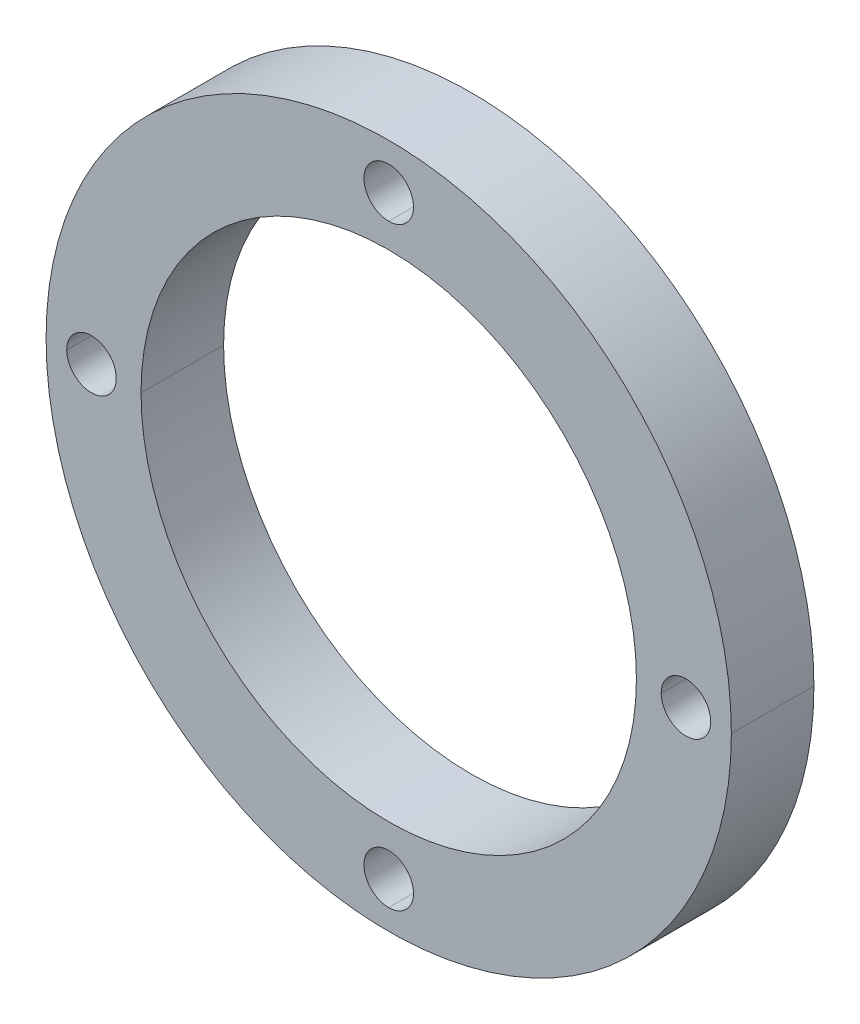
ISO-10303-21;
HEADER;
FILE_DESCRIPTION(('STEP AP214'),'2;1');
FILE_NAME('part.step','',(''),(''),'','','');
FILE_SCHEMA(('AUTOMOTIVE_DESIGN { 1 0 10303 214 1 1 1 1 }'));
ENDSEC;
DATA;
#1=APPLICATION_CONTEXT('core data for automotive mechanical design processes');
#2=APPLICATION_PROTOCOL_DEFINITION('international standard','automotive_design',2000,#1);
#3=PRODUCT_CONTEXT('',#1,'mechanical');
#4=PRODUCT('Part','Part','',(#3));
#5=PRODUCT_RELATED_PRODUCT_CATEGORY('part','',(#4));
#6=PRODUCT_DEFINITION_FORMATION('','',#4);
#7=PRODUCT_DEFINITION_CONTEXT('part definition',#1,'design');
#8=PRODUCT_DEFINITION('design','',#6,#7);
#9=PRODUCT_DEFINITION_SHAPE('','',#8);
#10=(LENGTH_UNIT() NAMED_UNIT(*) SI_UNIT(.MILLI.,.METRE.));
#11=(NAMED_UNIT(*) PLANE_ANGLE_UNIT() SI_UNIT($,.RADIAN.));
#12=(NAMED_UNIT(*) SI_UNIT($,.STERADIAN.) SOLID_ANGLE_UNIT());
#13=UNCERTAINTY_MEASURE_WITH_UNIT(LENGTH_MEASURE(1.E-05),#10,'distance_accuracy_value','');
#14=(GEOMETRIC_REPRESENTATION_CONTEXT(3) GLOBAL_UNCERTAINTY_ASSIGNED_CONTEXT((#13)) GLOBAL_UNIT_ASSIGNED_CONTEXT((#10,
#11,#12)) REPRESENTATION_CONTEXT('',''));
#15=CARTESIAN_POINT('',(0.,0.,0.));
#16=DIRECTION('',(0.,0.,1.));
#17=DIRECTION('',(1.,0.,0.));
#18=AXIS2_PLACEMENT_3D('',#15,#16,#17);
#19=CARTESIAN_POINT('',(199.4677415,-219.4589499,666.9));
#20=CARTESIAN_POINT('',(199.4677415,-219.4589499,671.9));
#21=(BOUNDED_CURVE() B_SPLINE_CURVE(1,(#19,#20),.UNSPECIFIED.,.F.,
.F.) B_SPLINE_CURVE_WITH_KNOTS((2,2),(0.,1.),
.UNSPECIFIED.) CURVE() GEOMETRIC_REPRESENTATION_ITEM() RATIONAL_B_SPLINE_CURVE((1.,1.)) REPRESENTATION_ITEM(''));
#22=CARTESIAN_POINT('',(197.9677415,-219.4589499,669.4));
#23=DIRECTION('',(0.,0.,1.));
#24=AXIS1_PLACEMENT('',#22,#23);
#25=SURFACE_OF_REVOLUTION('',#21,#24);
#26=CARTESIAN_POINT('',(197.9677415,-219.4589499,671.9));
#27=DIRECTION('',(0.,0.,1.));
#28=DIRECTION('',(1.,0.,0.));
#29=AXIS2_PLACEMENT_3D('',#26,#27,#28);
#30=CIRCLE('',#29,1.5);
#31=CARTESIAN_POINT('',(199.4677415,-219.4589499,671.9));
#32=VERTEX_POINT('',#31);
#33=CARTESIAN_POINT('',(196.4677415,-219.4589499,671.9));
#34=VERTEX_POINT('',#33);
#35=EDGE_CURVE('E102',#32,#34,#30,.T.);
#36=ORIENTED_EDGE('',*,*,#35,.T.);
#37=CARTESIAN_POINT('',(196.4677415,-219.4589499,671.9));
#38=CARTESIAN_POINT('',(196.4677415,-219.4589499,671.691666666667));
#39=CARTESIAN_POINT('',(196.4677415,-219.4589499,671.483333333333));
#40=CARTESIAN_POINT('',(196.4677415,-219.4589499,671.066666666667));
#41=CARTESIAN_POINT('',(196.4677415,-219.4589499,670.858333333333));
#42=CARTESIAN_POINT('',(196.4677415,-219.4589499,670.441666666667));
#43=CARTESIAN_POINT('',(196.4677415,-219.4589499,670.233333333333));
#44=CARTESIAN_POINT('',(196.4677415,-219.4589499,669.816666666667));
#45=CARTESIAN_POINT('',(196.4677415,-219.4589499,669.608333333333));
#46=CARTESIAN_POINT('',(196.4677415,-219.4589499,669.191666666667));
#47=CARTESIAN_POINT('',(196.4677415,-219.4589499,668.983333333333));
#48=CARTESIAN_POINT('',(196.4677415,-219.4589499,668.566666666667));
#49=CARTESIAN_POINT('',(196.4677415,-219.4589499,668.358333333333));
#50=CARTESIAN_POINT('',(196.4677415,-219.4589499,667.941666666667));
#51=CARTESIAN_POINT('',(196.4677415,-219.4589499,667.733333333333));
#52=CARTESIAN_POINT('',(196.4677415,-219.4589499,667.316666666667));
#53=CARTESIAN_POINT('',(196.4677415,-219.4589499,667.108333333333));
#54=CARTESIAN_POINT('',(196.4677415,-219.4589499,666.9));
#55=B_SPLINE_CURVE_WITH_KNOTS('',3,(#37,#38,#39,#40,#41,#42,#43,#44,#45,#46,#47,#48,#49,#50,#51,
#52,#53,#54),.UNSPECIFIED.,.F.,.F.,(4,2,2,2,2,2,2,2,4),(0.,0.624999999999987,1.24999999999997,
1.87499999999996,2.50000000000006,3.12499999999993,3.75000000000003,4.37500000000002,5.),.UNSPECIFIED.);
#56=CARTESIAN_POINT('',(196.4677415,-219.4589499,666.9));
#57=VERTEX_POINT('',#56);
#58=EDGE_CURVE('E125',#34,#57,#55,.T.);
#59=ORIENTED_EDGE('',*,*,#58,.T.);
#60=CARTESIAN_POINT('',(197.9677415,-219.4589499,666.9));
#61=DIRECTION('',(0.,0.,-1.));
#62=DIRECTION('',(-1.,0.,0.));
#63=AXIS2_PLACEMENT_3D('',#60,#61,#62);
#64=CIRCLE('',#63,1.5);
#65=CARTESIAN_POINT('',(199.4677415,-219.4589499,666.9));
#66=VERTEX_POINT('',#65);
#67=EDGE_CURVE('E118',#57,#66,#64,.T.);
#68=ORIENTED_EDGE('',*,*,#67,.T.);
#69=CARTESIAN_POINT('',(199.4677415,-219.4589499,666.9));
#70=CARTESIAN_POINT('',(199.4677415,-219.4589499,667.108333333333));
#71=CARTESIAN_POINT('',(199.4677415,-219.4589499,667.316666666667));
#72=CARTESIAN_POINT('',(199.4677415,-219.4589499,667.733333333333));
#73=CARTESIAN_POINT('',(199.4677415,-219.4589499,667.941666666667));
#74=CARTESIAN_POINT('',(199.4677415,-219.4589499,668.358333333333));
#75=CARTESIAN_POINT('',(199.4677415,-219.4589499,668.566666666667));
#76=CARTESIAN_POINT('',(199.4677415,-219.4589499,668.983333333333));
#77=CARTESIAN_POINT('',(199.4677415,-219.4589499,669.191666666667));
#78=CARTESIAN_POINT('',(199.4677415,-219.4589499,669.608333333333));
#79=CARTESIAN_POINT('',(199.4677415,-219.4589499,669.816666666667));
#80=CARTESIAN_POINT('',(199.4677415,-219.4589499,670.233333333333));
#81=CARTESIAN_POINT('',(199.4677415,-219.4589499,670.441666666667));
#82=CARTESIAN_POINT('',(199.4677415,-219.4589499,670.858333333333));
#83=CARTESIAN_POINT('',(199.4677415,-219.4589499,671.066666666667));
#84=CARTESIAN_POINT('',(199.4677415,-219.4589499,671.483333333333));
#85=CARTESIAN_POINT('',(199.4677415,-219.4589499,671.691666666667));
#86=CARTESIAN_POINT('',(199.4677415,-219.4589499,671.9));
#87=B_SPLINE_CURVE_WITH_KNOTS('',3,(#69,#70,#71,#72,#73,#74,#75,#76,#77,#78,#79,#80,#81,#82,#83,
#84,#85,#86),.UNSPECIFIED.,.F.,.F.,(4,2,2,2,2,2,2,2,4),(0.,0.624999999999987,1.24999999999997,
1.87500000000007,2.49999999999995,3.12500000000004,3.75000000000003,4.37500000000002,5.),.UNSPECIFIED.);
#88=EDGE_CURVE('E116',#66,#32,#87,.T.);
#89=ORIENTED_EDGE('',*,*,#88,.T.);
#90=EDGE_LOOP('',(#36,#59,#68,#89));
#91=FACE_BOUND('',#90,.T.);
#92=ADVANCED_FACE('F14',(#91),#25,.F.);
#93=CARTESIAN_POINT('',(196.4677415,-219.4589499,666.9));
#94=CARTESIAN_POINT('',(196.4677415,-219.4589499,671.9));
#95=(BOUNDED_CURVE() B_SPLINE_CURVE(1,(#93,#94),.UNSPECIFIED.,.F.,
.F.) B_SPLINE_CURVE_WITH_KNOTS((2,2),(0.,1.),
.UNSPECIFIED.) CURVE() GEOMETRIC_REPRESENTATION_ITEM() RATIONAL_B_SPLINE_CURVE((1.,1.)) REPRESENTATION_ITEM(''));
#96=CARTESIAN_POINT('',(197.9677415,-219.4589499,669.4));
#97=DIRECTION('',(0.,0.,1.));
#98=AXIS1_PLACEMENT('',#96,#97);
#99=SURFACE_OF_REVOLUTION('',#95,#98);
#100=CARTESIAN_POINT('',(197.9677415,-219.4589499,671.9));
#101=DIRECTION('',(0.,0.,1.));
#102=DIRECTION('',(-1.,0.,0.));
#103=AXIS2_PLACEMENT_3D('',#100,#101,#102);
#104=CIRCLE('',#103,1.5);
#105=EDGE_CURVE('E107',#34,#32,#104,.T.);
#106=ORIENTED_EDGE('',*,*,#105,.T.);
#107=ORIENTED_EDGE('',*,*,#88,.F.);
#108=CARTESIAN_POINT('',(197.9677415,-219.4589499,666.9));
#109=DIRECTION('',(0.,0.,-1.));
#110=DIRECTION('',(1.,0.,0.));
#111=AXIS2_PLACEMENT_3D('',#108,#109,#110);
#112=CIRCLE('',#111,1.5);
#113=EDGE_CURVE('E166',#66,#57,#112,.T.);
#114=ORIENTED_EDGE('',*,*,#113,.T.);
#115=ORIENTED_EDGE('',*,*,#58,.F.);
#116=EDGE_LOOP('',(#106,#107,#114,#115));
#117=FACE_BOUND('',#116,.T.);
#118=ADVANCED_FACE('F128',(#117),#99,.F.);
#119=CARTESIAN_POINT('',(164.9677415,-219.4589499,671.9));
#120=CARTESIAN_POINT('',(164.9677415,-219.4589499,666.9));
#121=(BOUNDED_CURVE() B_SPLINE_CURVE(1,(#119,#120),.UNSPECIFIED.,.F.,
.F.) B_SPLINE_CURVE_WITH_KNOTS((2,2),(0.,1.),
.UNSPECIFIED.) CURVE() GEOMETRIC_REPRESENTATION_ITEM() RATIONAL_B_SPLINE_CURVE((1.,1.)) REPRESENTATION_ITEM(''));
#122=CARTESIAN_POINT('',(179.9677415,-219.4589499,669.4));
#123=DIRECTION('',(0.,0.,-1.));
#124=AXIS1_PLACEMENT('',#122,#123);
#125=SURFACE_OF_REVOLUTION('',#121,#124);
#126=CARTESIAN_POINT('',(179.9677415,-219.4589499,666.9));
#127=DIRECTION('',(0.,0.,-1.));
#128=DIRECTION('',(-1.,0.,0.));
#129=AXIS2_PLACEMENT_3D('',#126,#127,#128);
#130=CIRCLE('',#129,15.);
#131=CARTESIAN_POINT('',(164.9677415,-219.4589499,666.9));
#132=VERTEX_POINT('',#131);
#133=CARTESIAN_POINT('',(194.9677415,-219.4589499,666.9));
#134=VERTEX_POINT('',#133);
#135=EDGE_CURVE('E681',#132,#134,#130,.T.);
#136=ORIENTED_EDGE('',*,*,#135,.T.);
#137=CARTESIAN_POINT('',(194.9677415,-219.4589499,666.9));
#138=CARTESIAN_POINT('',(194.9677415,-219.4589499,667.108333333333));
#139=CARTESIAN_POINT('',(194.9677415,-219.4589499,667.316666666667));
#140=CARTESIAN_POINT('',(194.9677415,-219.4589499,667.733333333333));
#141=CARTESIAN_POINT('',(194.9677415,-219.4589499,667.941666666667));
#142=CARTESIAN_POINT('',(194.9677415,-219.4589499,668.358333333333));
#143=CARTESIAN_POINT('',(194.9677415,-219.4589499,668.566666666667));
#144=CARTESIAN_POINT('',(194.9677415,-219.4589499,668.983333333333));
#145=CARTESIAN_POINT('',(194.9677415,-219.4589499,669.191666666667));
#146=CARTESIAN_POINT('',(194.9677415,-219.4589499,669.608333333333));
#147=CARTESIAN_POINT('',(194.9677415,-219.4589499,669.816666666667));
#148=CARTESIAN_POINT('',(194.9677415,-219.4589499,670.233333333333));
#149=CARTESIAN_POINT('',(194.9677415,-219.4589499,670.441666666667));
#150=CARTESIAN_POINT('',(194.9677415,-219.4589499,670.858333333333));
#151=CARTESIAN_POINT('',(194.9677415,-219.4589499,671.066666666667));
#152=CARTESIAN_POINT('',(194.9677415,-219.4589499,671.483333333333));
#153=CARTESIAN_POINT('',(194.9677415,-219.4589499,671.691666666667));
#154=CARTESIAN_POINT('',(194.9677415,-219.4589499,671.9));
#155=B_SPLINE_CURVE_WITH_KNOTS('',3,(#137,#138,#139,#140,#141,#142,#143,#144,#145,#146,#147,
#148,#149,#150,#151,#152,#153,#154),.UNSPECIFIED.,.F.,.F.,(4,2,2,2,2,2,2,2,4),(0.,
0.624999999999987,1.24999999999997,1.87500000000007,2.49999999999995,3.12500000000004,
3.75000000000003,4.37500000000002,5.),.UNSPECIFIED.);
#156=CARTESIAN_POINT('',(194.9677415,-219.4589499,671.9));
#157=VERTEX_POINT('',#156);
#158=EDGE_CURVE('E226',#134,#157,#155,.T.);
#159=ORIENTED_EDGE('',*,*,#158,.T.);
#160=CARTESIAN_POINT('',(179.9677415,-219.4589499,671.9));
#161=DIRECTION('',(0.,0.,1.));
#162=DIRECTION('',(1.,0.,0.));
#163=AXIS2_PLACEMENT_3D('',#160,#161,#162);
#164=CIRCLE('',#163,15.);
#165=CARTESIAN_POINT('',(164.9677415,-219.4589499,671.9));
#166=VERTEX_POINT('',#165);
#167=EDGE_CURVE('E131',#157,#166,#164,.T.);
#168=ORIENTED_EDGE('',*,*,#167,.T.);
#169=CARTESIAN_POINT('',(164.9677415,-219.4589499,671.9));
#170=CARTESIAN_POINT('',(164.9677415,-219.4589499,671.691666666667));
#171=CARTESIAN_POINT('',(164.9677415,-219.4589499,671.483333333333));
#172=CARTESIAN_POINT('',(164.9677415,-219.4589499,671.066666666667));
#173=CARTESIAN_POINT('',(164.9677415,-219.4589499,670.858333333333));
#174=CARTESIAN_POINT('',(164.9677415,-219.4589499,670.441666666667));
#175=CARTESIAN_POINT('',(164.9677415,-219.4589499,670.233333333333));
#176=CARTESIAN_POINT('',(164.9677415,-219.4589499,669.816666666667));
#177=CARTESIAN_POINT('',(164.9677415,-219.4589499,669.608333333333));
#178=CARTESIAN_POINT('',(164.9677415,-219.4589499,669.191666666667));
#179=CARTESIAN_POINT('',(164.9677415,-219.4589499,668.983333333333));
#180=CARTESIAN_POINT('',(164.9677415,-219.4589499,668.566666666667));
#181=CARTESIAN_POINT('',(164.9677415,-219.4589499,668.358333333333));
#182=CARTESIAN_POINT('',(164.9677415,-219.4589499,667.941666666667));
#183=CARTESIAN_POINT('',(164.9677415,-219.4589499,667.733333333333));
#184=CARTESIAN_POINT('',(164.9677415,-219.4589499,667.316666666667));
#185=CARTESIAN_POINT('',(164.9677415,-219.4589499,667.108333333333));
#186=CARTESIAN_POINT('',(164.9677415,-219.4589499,666.9));
#187=B_SPLINE_CURVE_WITH_KNOTS('',3,(#169,#170,#171,#172,#173,#174,#175,#176,#177,#178,#179,
#180,#181,#182,#183,#184,#185,#186),.UNSPECIFIED.,.F.,.F.,(4,2,2,2,2,2,2,2,4),(0.,
0.624999999999987,1.24999999999997,1.87499999999996,2.50000000000006,3.12499999999993,
3.75000000000003,4.37500000000002,5.),.UNSPECIFIED.);
#188=EDGE_CURVE('E233',#166,#132,#187,.T.);
#189=ORIENTED_EDGE('',*,*,#188,.T.);
#190=EDGE_LOOP('',(#136,#159,#168,#189));
#191=FACE_BOUND('',#190,.T.);
#192=ADVANCED_FACE('F148',(#191),#125,.F.);
#193=CARTESIAN_POINT('',(194.9677415,-219.4589499,671.9));
#194=CARTESIAN_POINT('',(194.9677415,-219.4589499,666.9));
#195=(BOUNDED_CURVE() B_SPLINE_CURVE(1,(#193,#194),.UNSPECIFIED.,.F.,
.F.) B_SPLINE_CURVE_WITH_KNOTS((2,2),(0.,1.),
.UNSPECIFIED.) CURVE() GEOMETRIC_REPRESENTATION_ITEM() RATIONAL_B_SPLINE_CURVE((1.,1.)) REPRESENTATION_ITEM(''));
#196=CARTESIAN_POINT('',(179.9677415,-219.4589499,669.4));
#197=DIRECTION('',(0.,0.,-1.));
#198=AXIS1_PLACEMENT('',#196,#197);
#199=SURFACE_OF_REVOLUTION('',#195,#198);
#200=CARTESIAN_POINT('',(179.9677415,-219.4589499,666.9));
#201=DIRECTION('',(0.,0.,-1.));
#202=DIRECTION('',(1.,0.,0.));
#203=AXIS2_PLACEMENT_3D('',#200,#201,#202);
#204=CIRCLE('',#203,15.);
#205=EDGE_CURVE('E183',#134,#132,#204,.T.);
#206=ORIENTED_EDGE('',*,*,#205,.T.);
#207=ORIENTED_EDGE('',*,*,#188,.F.);
#208=CARTESIAN_POINT('',(179.9677415,-219.4589499,671.9));
#209=DIRECTION('',(0.,0.,1.));
#210=DIRECTION('',(-1.,0.,0.));
#211=AXIS2_PLACEMENT_3D('',#208,#209,#210);
#212=CIRCLE('',#211,15.);
#213=EDGE_CURVE('E620',#166,#157,#212,.T.);
#214=ORIENTED_EDGE('',*,*,#213,.T.);
#215=ORIENTED_EDGE('',*,*,#158,.F.);
#216=EDGE_LOOP('',(#206,#207,#214,#215));
#217=FACE_BOUND('',#216,.T.);
#218=ADVANCED_FACE('F582',(#217),#199,.F.);
#219=CARTESIAN_POINT('',(179.9677415,-199.9589499,666.9));
#220=CARTESIAN_POINT('',(179.9677415,-199.9589499,671.9));
#221=(BOUNDED_CURVE() B_SPLINE_CURVE(1,(#219,#220),.UNSPECIFIED.,.F.,
.F.) B_SPLINE_CURVE_WITH_KNOTS((2,2),(0.,1.),
.UNSPECIFIED.) CURVE() GEOMETRIC_REPRESENTATION_ITEM() RATIONAL_B_SPLINE_CURVE((1.,1.)) REPRESENTATION_ITEM(''));
#222=CARTESIAN_POINT('',(179.9677415,-201.4589499,669.4));
#223=DIRECTION('',(0.,0.,1.));
#224=AXIS1_PLACEMENT('',#222,#223);
#225=SURFACE_OF_REVOLUTION('',#221,#224);
#226=CARTESIAN_POINT('',(179.9677415,-201.4589499,671.9));
#227=DIRECTION('',(0.,0.,1.));
#228=DIRECTION('',(0.,1.,0.));
#229=AXIS2_PLACEMENT_3D('',#226,#227,#228);
#230=CIRCLE('',#229,1.5);
#231=CARTESIAN_POINT('',(179.9677415,-199.9589499,671.9));
#232=VERTEX_POINT('',#231);
#233=CARTESIAN_POINT('',(179.9677415,-202.9589499,671.9));
#234=VERTEX_POINT('',#233);
#235=EDGE_CURVE('E984',#232,#234,#230,.T.);
#236=ORIENTED_EDGE('',*,*,#235,.T.);
#237=CARTESIAN_POINT('',(179.9677415,-202.9589499,671.9));
#238=CARTESIAN_POINT('',(179.9677415,-202.9589499,671.691666666667));
#239=CARTESIAN_POINT('',(179.9677415,-202.9589499,671.483333333333));
#240=CARTESIAN_POINT('',(179.9677415,-202.9589499,671.066666666667));
#241=CARTESIAN_POINT('',(179.9677415,-202.9589499,670.858333333333));
#242=CARTESIAN_POINT('',(179.9677415,-202.9589499,670.441666666667));
#243=CARTESIAN_POINT('',(179.9677415,-202.9589499,670.233333333333));
#244=CARTESIAN_POINT('',(179.9677415,-202.9589499,669.816666666667));
#245=CARTESIAN_POINT('',(179.9677415,-202.9589499,669.608333333333));
#246=CARTESIAN_POINT('',(179.9677415,-202.9589499,669.191666666667));
#247=CARTESIAN_POINT('',(179.9677415,-202.9589499,668.983333333333));
#248=CARTESIAN_POINT('',(179.9677415,-202.9589499,668.566666666667));
#249=CARTESIAN_POINT('',(179.9677415,-202.9589499,668.358333333333));
#250=CARTESIAN_POINT('',(179.9677415,-202.9589499,667.941666666667));
#251=CARTESIAN_POINT('',(179.9677415,-202.9589499,667.733333333333));
#252=CARTESIAN_POINT('',(179.9677415,-202.9589499,667.316666666667));
#253=CARTESIAN_POINT('',(179.9677415,-202.9589499,667.108333333333));
#254=CARTESIAN_POINT('',(179.9677415,-202.9589499,666.9));
#255=B_SPLINE_CURVE_WITH_KNOTS('',3,(#237,#238,#239,#240,#241,#242,#243,#244,#245,#246,#247,
#248,#249,#250,#251,#252,#253,#254),.UNSPECIFIED.,.F.,.F.,(4,2,2,2,2,2,2,2,4),(0.,
0.624999999999987,1.24999999999997,1.87499999999996,2.50000000000006,3.12499999999993,
3.75000000000003,4.37500000000002,5.),.UNSPECIFIED.);
#256=CARTESIAN_POINT('',(179.9677415,-202.9589499,666.9));
#257=VERTEX_POINT('',#256);
#258=EDGE_CURVE('E210',#234,#257,#255,.T.);
#259=ORIENTED_EDGE('',*,*,#258,.T.);
#260=CARTESIAN_POINT('',(179.9677415,-201.4589499,666.9));
#261=DIRECTION('',(0.,0.,-1.));
#262=DIRECTION('',(0.,-1.,0.));
#263=AXIS2_PLACEMENT_3D('',#260,#261,#262);
#264=CIRCLE('',#263,1.5);
#265=CARTESIAN_POINT('',(179.9677415,-199.9589499,666.9));
#266=VERTEX_POINT('',#265);
#267=EDGE_CURVE('E695',#257,#266,#264,.T.);
#268=ORIENTED_EDGE('',*,*,#267,.T.);
#269=CARTESIAN_POINT('',(179.9677415,-199.9589499,666.9));
#270=CARTESIAN_POINT('',(179.9677415,-199.9589499,667.108333333333));
#271=CARTESIAN_POINT('',(179.9677415,-199.9589499,667.316666666667));
#272=CARTESIAN_POINT('',(179.9677415,-199.9589499,667.733333333333));
#273=CARTESIAN_POINT('',(179.9677415,-199.9589499,667.941666666667));
#274=CARTESIAN_POINT('',(179.9677415,-199.9589499,668.358333333333));
#275=CARTESIAN_POINT('',(179.9677415,-199.9589499,668.566666666667));
#276=CARTESIAN_POINT('',(179.9677415,-199.9589499,668.983333333333));
#277=CARTESIAN_POINT('',(179.9677415,-199.9589499,669.191666666667));
#278=CARTESIAN_POINT('',(179.9677415,-199.9589499,669.608333333333));
#279=CARTESIAN_POINT('',(179.9677415,-199.9589499,669.816666666667));
#280=CARTESIAN_POINT('',(179.9677415,-199.9589499,670.233333333333));
#281=CARTESIAN_POINT('',(179.9677415,-199.9589499,670.441666666667));
#282=CARTESIAN_POINT('',(179.9677415,-199.9589499,670.858333333333));
#283=CARTESIAN_POINT('',(179.9677415,-199.9589499,671.066666666667));
#284=CARTESIAN_POINT('',(179.9677415,-199.9589499,671.483333333333));
#285=CARTESIAN_POINT('',(179.9677415,-199.9589499,671.691666666667));
#286=CARTESIAN_POINT('',(179.9677415,-199.9589499,671.9));
#287=B_SPLINE_CURVE_WITH_KNOTS('',3,(#269,#270,#271,#272,#273,#274,#275,#276,#277,#278,#279,
#280,#281,#282,#283,#284,#285,#286),.UNSPECIFIED.,.F.,.F.,(4,2,2,2,2,2,2,2,4),(0.,
0.624999999999987,1.24999999999997,1.87500000000007,2.49999999999995,3.12500000000004,
3.75000000000003,4.37500000000002,5.),.UNSPECIFIED.);
#288=EDGE_CURVE('E216',#266,#232,#287,.T.);
#289=ORIENTED_EDGE('',*,*,#288,.T.);
#290=EDGE_LOOP('',(#236,#259,#268,#289));
#291=FACE_BOUND('',#290,.T.);
#292=ADVANCED_FACE('F579',(#291),#225,.F.);
#293=CARTESIAN_POINT('',(179.9677415,-202.9589499,666.9));
#294=CARTESIAN_POINT('',(179.9677415,-202.9589499,671.9));
#295=(BOUNDED_CURVE() B_SPLINE_CURVE(1,(#293,#294),.UNSPECIFIED.,.F.,
.F.) B_SPLINE_CURVE_WITH_KNOTS((2,2),(0.,1.),
.UNSPECIFIED.) CURVE() GEOMETRIC_REPRESENTATION_ITEM() RATIONAL_B_SPLINE_CURVE((1.,1.)) REPRESENTATION_ITEM(''));
#296=CARTESIAN_POINT('',(179.9677415,-201.4589499,669.4));
#297=DIRECTION('',(0.,0.,1.));
#298=AXIS1_PLACEMENT('',#296,#297);
#299=SURFACE_OF_REVOLUTION('',#295,#298);
#300=CARTESIAN_POINT('',(179.9677415,-201.4589499,671.9));
#301=DIRECTION('',(0.,0.,1.));
#302=DIRECTION('',(0.,-1.,0.));
#303=AXIS2_PLACEMENT_3D('',#300,#301,#302);
#304=CIRCLE('',#303,1.5);
#305=EDGE_CURVE('E553',#234,#232,#304,.T.);
#306=ORIENTED_EDGE('',*,*,#305,.T.);
#307=ORIENTED_EDGE('',*,*,#288,.F.);
#308=CARTESIAN_POINT('',(179.9677415,-201.4589499,666.9));
#309=DIRECTION('',(0.,0.,-1.));
#310=DIRECTION('',(0.,1.,0.));
#311=AXIS2_PLACEMENT_3D('',#308,#309,#310);
#312=CIRCLE('',#311,1.5);
#313=EDGE_CURVE('E533',#266,#257,#312,.T.);
#314=ORIENTED_EDGE('',*,*,#313,.T.);
#315=ORIENTED_EDGE('',*,*,#258,.F.);
#316=EDGE_LOOP('',(#306,#307,#314,#315));
#317=FACE_BOUND('',#316,.T.);
#318=ADVANCED_FACE('F493',(#317),#299,.F.);
#319=CARTESIAN_POINT('',(160.4677415,-219.4589499,666.9));
#320=CARTESIAN_POINT('',(160.4677415,-219.4589499,671.9));
#321=(BOUNDED_CURVE() B_SPLINE_CURVE(1,(#319,#320),.UNSPECIFIED.,.F.,
.F.) B_SPLINE_CURVE_WITH_KNOTS((2,2),(0.,1.),
.UNSPECIFIED.) CURVE() GEOMETRIC_REPRESENTATION_ITEM() RATIONAL_B_SPLINE_CURVE((1.,1.)) REPRESENTATION_ITEM(''));
#322=CARTESIAN_POINT('',(161.9677415,-219.4589499,669.4));
#323=DIRECTION('',(0.,0.,1.));
#324=AXIS1_PLACEMENT('',#322,#323);
#325=SURFACE_OF_REVOLUTION('',#321,#324);
#326=CARTESIAN_POINT('',(161.9677415,-219.4589499,671.9));
#327=DIRECTION('',(0.,0.,1.));
#328=DIRECTION('',(-1.,0.,0.));
#329=AXIS2_PLACEMENT_3D('',#326,#327,#328);
#330=CIRCLE('',#329,1.5);
#331=CARTESIAN_POINT('',(160.4677415,-219.4589499,671.9));
#332=VERTEX_POINT('',#331);
#333=CARTESIAN_POINT('',(163.4677415,-219.4589499,671.9));
#334=VERTEX_POINT('',#333);
#335=EDGE_CURVE('E965',#332,#334,#330,.T.);
#336=ORIENTED_EDGE('',*,*,#335,.T.);
#337=CARTESIAN_POINT('',(163.4677415,-219.4589499,671.9));
#338=CARTESIAN_POINT('',(163.4677415,-219.4589499,671.691666666667));
#339=CARTESIAN_POINT('',(163.4677415,-219.4589499,671.483333333333));
#340=CARTESIAN_POINT('',(163.4677415,-219.4589499,671.066666666667));
#341=CARTESIAN_POINT('',(163.4677415,-219.4589499,670.858333333333));
#342=CARTESIAN_POINT('',(163.4677415,-219.4589499,670.441666666667));
#343=CARTESIAN_POINT('',(163.4677415,-219.4589499,670.233333333333));
#344=CARTESIAN_POINT('',(163.4677415,-219.4589499,669.816666666667));
#345=CARTESIAN_POINT('',(163.4677415,-219.4589499,669.608333333333));
#346=CARTESIAN_POINT('',(163.4677415,-219.4589499,669.191666666667));
#347=CARTESIAN_POINT('',(163.4677415,-219.4589499,668.983333333333));
#348=CARTESIAN_POINT('',(163.4677415,-219.4589499,668.566666666667));
#349=CARTESIAN_POINT('',(163.4677415,-219.4589499,668.358333333333));
#350=CARTESIAN_POINT('',(163.4677415,-219.4589499,667.941666666667));
#351=CARTESIAN_POINT('',(163.4677415,-219.4589499,667.733333333333));
#352=CARTESIAN_POINT('',(163.4677415,-219.4589499,667.316666666667));
#353=CARTESIAN_POINT('',(163.4677415,-219.4589499,667.108333333333));
#354=CARTESIAN_POINT('',(163.4677415,-219.4589499,666.9));
#355=B_SPLINE_CURVE_WITH_KNOTS('',3,(#337,#338,#339,#340,#341,#342,#343,#344,#345,#346,#347,
#348,#349,#350,#351,#352,#353,#354),.UNSPECIFIED.,.F.,.F.,(4,2,2,2,2,2,2,2,4),(0.,
0.624999999999987,1.24999999999997,1.87499999999996,2.50000000000006,3.12499999999993,
3.75000000000003,4.37500000000002,5.),.UNSPECIFIED.);
#356=CARTESIAN_POINT('',(163.4677415,-219.4589499,666.9));
#357=VERTEX_POINT('',#356);
#358=EDGE_CURVE('E194',#334,#357,#355,.T.);
#359=ORIENTED_EDGE('',*,*,#358,.T.);
#360=CARTESIAN_POINT('',(161.9677415,-219.4589499,666.9));
#361=DIRECTION('',(0.,0.,-1.));
#362=DIRECTION('',(1.,0.,0.));
#363=AXIS2_PLACEMENT_3D('',#360,#361,#362);
#364=CIRCLE('',#363,1.5);
#365=CARTESIAN_POINT('',(160.4677415,-219.4589499,666.9));
#366=VERTEX_POINT('',#365);
#367=EDGE_CURVE('E1069',#357,#366,#364,.T.);
#368=ORIENTED_EDGE('',*,*,#367,.T.);
#369=CARTESIAN_POINT('',(160.4677415,-219.4589499,666.9));
#370=CARTESIAN_POINT('',(160.4677415,-219.4589499,667.108333333333));
#371=CARTESIAN_POINT('',(160.4677415,-219.4589499,667.316666666667));
#372=CARTESIAN_POINT('',(160.4677415,-219.4589499,667.733333333333));
#373=CARTESIAN_POINT('',(160.4677415,-219.4589499,667.941666666667));
#374=CARTESIAN_POINT('',(160.4677415,-219.4589499,668.358333333333));
#375=CARTESIAN_POINT('',(160.4677415,-219.4589499,668.566666666667));
#376=CARTESIAN_POINT('',(160.4677415,-219.4589499,668.983333333333));
#377=CARTESIAN_POINT('',(160.4677415,-219.4589499,669.191666666667));
#378=CARTESIAN_POINT('',(160.4677415,-219.4589499,669.608333333333));
#379=CARTESIAN_POINT('',(160.4677415,-219.4589499,669.816666666667));
#380=CARTESIAN_POINT('',(160.4677415,-219.4589499,670.233333333333));
#381=CARTESIAN_POINT('',(160.4677415,-219.4589499,670.441666666667));
#382=CARTESIAN_POINT('',(160.4677415,-219.4589499,670.858333333333));
#383=CARTESIAN_POINT('',(160.4677415,-219.4589499,671.066666666667));
#384=CARTESIAN_POINT('',(160.4677415,-219.4589499,671.483333333333));
#385=CARTESIAN_POINT('',(160.4677415,-219.4589499,671.691666666667));
#386=CARTESIAN_POINT('',(160.4677415,-219.4589499,671.9));
#387=B_SPLINE_CURVE_WITH_KNOTS('',3,(#369,#370,#371,#372,#373,#374,#375,#376,#377,#378,#379,
#380,#381,#382,#383,#384,#385,#386),.UNSPECIFIED.,.F.,.F.,(4,2,2,2,2,2,2,2,4),(0.,
0.624999999999987,1.24999999999997,1.87500000000007,2.49999999999995,3.12500000000004,
3.75000000000003,4.37500000000002,5.),.UNSPECIFIED.);
#388=EDGE_CURVE('E200',#366,#332,#387,.T.);
#389=ORIENTED_EDGE('',*,*,#388,.T.);
#390=EDGE_LOOP('',(#336,#359,#368,#389));
#391=FACE_BOUND('',#390,.T.);
#392=ADVANCED_FACE('F489',(#391),#325,.F.);
#393=CARTESIAN_POINT('',(163.4677415,-219.4589499,666.9));
#394=CARTESIAN_POINT('',(163.4677415,-219.4589499,671.9));
#395=(BOUNDED_CURVE() B_SPLINE_CURVE(1,(#393,#394),.UNSPECIFIED.,.F.,
.F.) B_SPLINE_CURVE_WITH_KNOTS((2,2),(0.,1.),
.UNSPECIFIED.) CURVE() GEOMETRIC_REPRESENTATION_ITEM() RATIONAL_B_SPLINE_CURVE((1.,1.)) REPRESENTATION_ITEM(''));
#396=CARTESIAN_POINT('',(161.9677415,-219.4589499,669.4));
#397=DIRECTION('',(0.,0.,1.));
#398=AXIS1_PLACEMENT('',#396,#397);
#399=SURFACE_OF_REVOLUTION('',#395,#398);
#400=CARTESIAN_POINT('',(161.9677415,-219.4589499,671.9));
#401=DIRECTION('',(0.,0.,1.));
#402=DIRECTION('',(1.,0.,0.));
#403=AXIS2_PLACEMENT_3D('',#400,#401,#402);
#404=CIRCLE('',#403,1.5);
#405=EDGE_CURVE('E463',#334,#332,#404,.T.);
#406=ORIENTED_EDGE('',*,*,#405,.T.);
#407=ORIENTED_EDGE('',*,*,#388,.F.);
#408=CARTESIAN_POINT('',(161.9677415,-219.4589499,666.9));
#409=DIRECTION('',(0.,0.,-1.));
#410=DIRECTION('',(-1.,0.,0.));
#411=AXIS2_PLACEMENT_3D('',#408,#409,#410);
#412=CIRCLE('',#411,1.5);
#413=EDGE_CURVE('E443',#366,#357,#412,.T.);
#414=ORIENTED_EDGE('',*,*,#413,.T.);
#415=ORIENTED_EDGE('',*,*,#358,.F.);
#416=EDGE_LOOP('',(#406,#407,#414,#415));
#417=FACE_BOUND('',#416,.T.);
#418=ADVANCED_FACE('F403',(#417),#399,.F.);
#419=CARTESIAN_POINT('',(179.9677415,-238.9589499,666.9));
#420=CARTESIAN_POINT('',(179.9677415,-238.9589499,671.9));
#421=(BOUNDED_CURVE() B_SPLINE_CURVE(1,(#419,#420),.UNSPECIFIED.,.F.,
.F.) B_SPLINE_CURVE_WITH_KNOTS((2,2),(0.,1.),
.UNSPECIFIED.) CURVE() GEOMETRIC_REPRESENTATION_ITEM() RATIONAL_B_SPLINE_CURVE((1.,1.)) REPRESENTATION_ITEM(''));
#422=CARTESIAN_POINT('',(179.9677415,-237.4589499,669.4));
#423=DIRECTION('',(0.,0.,1.));
#424=AXIS1_PLACEMENT('',#422,#423);
#425=SURFACE_OF_REVOLUTION('',#421,#424);
#426=CARTESIAN_POINT('',(179.9677415,-237.4589499,671.9));
#427=DIRECTION('',(0.,0.,1.));
#428=DIRECTION('',(0.,-1.,0.));
#429=AXIS2_PLACEMENT_3D('',#426,#427,#428);
#430=CIRCLE('',#429,1.5);
#431=CARTESIAN_POINT('',(179.9677415,-238.9589499,671.9));
#432=VERTEX_POINT('',#431);
#433=CARTESIAN_POINT('',(179.9677415,-235.9589499,671.9));
#434=VERTEX_POINT('',#433);
#435=EDGE_CURVE('E945',#432,#434,#430,.T.);
#436=ORIENTED_EDGE('',*,*,#435,.T.);
#437=CARTESIAN_POINT('',(179.9677415,-235.9589499,671.9));
#438=CARTESIAN_POINT('',(179.9677415,-235.9589499,671.691666666667));
#439=CARTESIAN_POINT('',(179.9677415,-235.9589499,671.483333333333));
#440=CARTESIAN_POINT('',(179.9677415,-235.9589499,671.066666666667));
#441=CARTESIAN_POINT('',(179.9677415,-235.9589499,670.858333333333));
#442=CARTESIAN_POINT('',(179.9677415,-235.9589499,670.441666666667));
#443=CARTESIAN_POINT('',(179.9677415,-235.9589499,670.233333333333));
#444=CARTESIAN_POINT('',(179.9677415,-235.9589499,669.816666666667));
#445=CARTESIAN_POINT('',(179.9677415,-235.9589499,669.608333333333));
#446=CARTESIAN_POINT('',(179.9677415,-235.9589499,669.191666666667));
#447=CARTESIAN_POINT('',(179.9677415,-235.9589499,668.983333333333));
#448=CARTESIAN_POINT('',(179.9677415,-235.9589499,668.566666666667));
#449=CARTESIAN_POINT('',(179.9677415,-235.9589499,668.358333333333));
#450=CARTESIAN_POINT('',(179.9677415,-235.9589499,667.941666666667));
#451=CARTESIAN_POINT('',(179.9677415,-235.9589499,667.733333333333));
#452=CARTESIAN_POINT('',(179.9677415,-235.9589499,667.316666666667));
#453=CARTESIAN_POINT('',(179.9677415,-235.9589499,667.108333333333));
#454=CARTESIAN_POINT('',(179.9677415,-235.9589499,666.9));
#455=B_SPLINE_CURVE_WITH_KNOTS('',3,(#437,#438,#439,#440,#441,#442,#443,#444,#445,#446,#447,
#448,#449,#450,#451,#452,#453,#454),.UNSPECIFIED.,.F.,.F.,(4,2,2,2,2,2,2,2,4),(0.,
0.624999999999987,1.24999999999997,1.87499999999996,2.50000000000006,3.12499999999993,
3.75000000000003,4.37500000000002,5.),.UNSPECIFIED.);
#456=CARTESIAN_POINT('',(179.9677415,-235.9589499,666.9));
#457=VERTEX_POINT('',#456);
#458=EDGE_CURVE('E177',#434,#457,#455,.T.);
#459=ORIENTED_EDGE('',*,*,#458,.T.);
#460=CARTESIAN_POINT('',(179.9677415,-237.4589499,666.9));
#461=DIRECTION('',(0.,0.,-1.));
#462=DIRECTION('',(0.,1.,0.));
#463=AXIS2_PLACEMENT_3D('',#460,#461,#462);
#464=CIRCLE('',#463,1.5);
#465=CARTESIAN_POINT('',(179.9677415,-238.9589499,666.9));
#466=VERTEX_POINT('',#465);
#467=EDGE_CURVE('E335',#457,#466,#464,.T.);
#468=ORIENTED_EDGE('',*,*,#467,.T.);
#469=CARTESIAN_POINT('',(179.9677415,-238.9589499,666.9));
#470=CARTESIAN_POINT('',(179.9677415,-238.9589499,667.108333333333));
#471=CARTESIAN_POINT('',(179.9677415,-238.9589499,667.316666666667));
#472=CARTESIAN_POINT('',(179.9677415,-238.9589499,667.733333333333));
#473=CARTESIAN_POINT('',(179.9677415,-238.9589499,667.941666666667));
#474=CARTESIAN_POINT('',(179.9677415,-238.9589499,668.358333333333));
#475=CARTESIAN_POINT('',(179.9677415,-238.9589499,668.566666666667));
#476=CARTESIAN_POINT('',(179.9677415,-238.9589499,668.983333333333));
#477=CARTESIAN_POINT('',(179.9677415,-238.9589499,669.191666666667));
#478=CARTESIAN_POINT('',(179.9677415,-238.9589499,669.608333333333));
#479=CARTESIAN_POINT('',(179.9677415,-238.9589499,669.816666666667));
#480=CARTESIAN_POINT('',(179.9677415,-238.9589499,670.233333333333));
#481=CARTESIAN_POINT('',(179.9677415,-238.9589499,670.441666666667));
#482=CARTESIAN_POINT('',(179.9677415,-238.9589499,670.858333333333));
#483=CARTESIAN_POINT('',(179.9677415,-238.9589499,671.066666666667));
#484=CARTESIAN_POINT('',(179.9677415,-238.9589499,671.483333333333));
#485=CARTESIAN_POINT('',(179.9677415,-238.9589499,671.691666666667));
#486=CARTESIAN_POINT('',(179.9677415,-238.9589499,671.9));
#487=B_SPLINE_CURVE_WITH_KNOTS('',3,(#469,#470,#471,#472,#473,#474,#475,#476,#477,#478,#479,
#480,#481,#482,#483,#484,#485,#486),.UNSPECIFIED.,.F.,.F.,(4,2,2,2,2,2,2,2,4),(0.,
0.624999999999987,1.24999999999997,1.87500000000007,2.49999999999995,3.12500000000004,
3.75000000000003,4.37500000000002,5.),.UNSPECIFIED.);
#488=EDGE_CURVE('E184',#466,#432,#487,.T.);
#489=ORIENTED_EDGE('',*,*,#488,.T.);
#490=EDGE_LOOP('',(#436,#459,#468,#489));
#491=FACE_BOUND('',#490,.T.);
#492=ADVANCED_FACE('F399',(#491),#425,.F.);
#493=CARTESIAN_POINT('',(179.9677415,-235.9589499,666.9));
#494=CARTESIAN_POINT('',(179.9677415,-235.9589499,671.9));
#495=(BOUNDED_CURVE() B_SPLINE_CURVE(1,(#493,#494),.UNSPECIFIED.,.F.,
.F.) B_SPLINE_CURVE_WITH_KNOTS((2,2),(0.,1.),
.UNSPECIFIED.) CURVE() GEOMETRIC_REPRESENTATION_ITEM() RATIONAL_B_SPLINE_CURVE((1.,1.)) REPRESENTATION_ITEM(''));
#496=CARTESIAN_POINT('',(179.9677415,-237.4589499,669.4));
#497=DIRECTION('',(0.,0.,1.));
#498=AXIS1_PLACEMENT('',#496,#497);
#499=SURFACE_OF_REVOLUTION('',#495,#498);
#500=CARTESIAN_POINT('',(179.9677415,-237.4589499,671.9));
#501=DIRECTION('',(0.,0.,1.));
#502=DIRECTION('',(0.,1.,0.));
#503=AXIS2_PLACEMENT_3D('',#500,#501,#502);
#504=CIRCLE('',#503,1.5);
#505=EDGE_CURVE('E373',#434,#432,#504,.T.);
#506=ORIENTED_EDGE('',*,*,#505,.T.);
#507=ORIENTED_EDGE('',*,*,#488,.F.);
#508=CARTESIAN_POINT('',(179.9677415,-237.4589499,666.9));
#509=DIRECTION('',(0.,0.,-1.));
#510=DIRECTION('',(0.,-1.,0.));
#511=AXIS2_PLACEMENT_3D('',#508,#509,#510);
#512=CIRCLE('',#511,1.5);
#513=EDGE_CURVE('E353',#466,#457,#512,.T.);
#514=ORIENTED_EDGE('',*,*,#513,.T.);
#515=ORIENTED_EDGE('',*,*,#458,.F.);
#516=EDGE_LOOP('',(#506,#507,#514,#515));
#517=FACE_BOUND('',#516,.T.);
#518=ADVANCED_FACE('F274',(#517),#499,.F.);
#519=CARTESIAN_POINT('',(0.,0.,666.9));
#520=DIRECTION('',(0.,0.,-1.));
#521=DIRECTION('',(-1.,0.,0.));
#522=AXIS2_PLACEMENT_3D('',#519,#520,#521);
#523=PLANE('',#522);
#524=ORIENTED_EDGE('',*,*,#513,.F.);
#525=ORIENTED_EDGE('',*,*,#467,.F.);
#526=EDGE_LOOP('',(#524,#525));
#527=FACE_BOUND('',#526,.T.);
#528=ORIENTED_EDGE('',*,*,#413,.F.);
#529=ORIENTED_EDGE('',*,*,#367,.F.);
#530=EDGE_LOOP('',(#528,#529));
#531=FACE_BOUND('',#530,.T.);
#532=ORIENTED_EDGE('',*,*,#313,.F.);
#533=ORIENTED_EDGE('',*,*,#267,.F.);
#534=EDGE_LOOP('',(#532,#533));
#535=FACE_BOUND('',#534,.T.);
#536=ORIENTED_EDGE('',*,*,#205,.F.);
#537=ORIENTED_EDGE('',*,*,#135,.F.);
#538=EDGE_LOOP('',(#536,#537));
#539=FACE_BOUND('',#538,.T.);
#540=ORIENTED_EDGE('',*,*,#113,.F.);
#541=ORIENTED_EDGE('',*,*,#67,.F.);
#542=EDGE_LOOP('',(#540,#541));
#543=FACE_BOUND('',#542,.T.);
#544=CARTESIAN_POINT('',(179.9677415,-219.4589499,666.9));
#545=DIRECTION('',(0.,0.,1.));
#546=DIRECTION('',(1.,0.,0.));
#547=AXIS2_PLACEMENT_3D('',#544,#545,#546);
#548=CIRCLE('',#547,20.75);
#549=CARTESIAN_POINT('',(159.2177415,-219.4589499,666.9));
#550=VERTEX_POINT('',#549);
#551=CARTESIAN_POINT('',(200.7177415,-219.4589499,666.9));
#552=VERTEX_POINT('',#551);
#553=EDGE_CURVE('E1033',#550,#552,#548,.F.);
#554=ORIENTED_EDGE('',*,*,#553,.T.);
#555=CARTESIAN_POINT('',(179.9677415,-219.4589499,666.9));
#556=DIRECTION('',(0.,0.,1.));
#557=DIRECTION('',(-1.,0.,0.));
#558=AXIS2_PLACEMENT_3D('',#555,#556,#557);
#559=CIRCLE('',#558,20.75);
#560=EDGE_CURVE('E1056',#552,#550,#559,.F.);
#561=ORIENTED_EDGE('',*,*,#560,.T.);
#562=EDGE_LOOP('',(#554,#561));
#563=FACE_BOUND('',#562,.T.);
#564=ADVANCED_FACE('F252',(#527,#531,#535,#539,#543,#563),#523,.T.);
#565=CARTESIAN_POINT('',(159.2177415,-219.4589499,671.9));
#566=CARTESIAN_POINT('',(159.2177415,-219.4589499,666.9));
#567=(BOUNDED_CURVE() B_SPLINE_CURVE(1,(#565,#566),.UNSPECIFIED.,.F.,
.F.) B_SPLINE_CURVE_WITH_KNOTS((2,2),(0.,1.),
.UNSPECIFIED.) CURVE() GEOMETRIC_REPRESENTATION_ITEM() RATIONAL_B_SPLINE_CURVE((1.,1.)) REPRESENTATION_ITEM(''));
#568=CARTESIAN_POINT('',(179.9677415,-219.4589499,669.4));
#569=DIRECTION('',(0.,0.,-1.));
#570=AXIS1_PLACEMENT('',#568,#569);
#571=SURFACE_OF_REVOLUTION('',#567,#570);
#572=CARTESIAN_POINT('',(200.7177415,-219.4589499,671.9));
#573=CARTESIAN_POINT('',(200.7177415,-219.4589499,671.691666666667));
#574=CARTESIAN_POINT('',(200.7177415,-219.4589499,671.483333333333));
#575=CARTESIAN_POINT('',(200.7177415,-219.4589499,671.066666666667));
#576=CARTESIAN_POINT('',(200.7177415,-219.4589499,670.858333333333));
#577=CARTESIAN_POINT('',(200.7177415,-219.4589499,670.441666666667));
#578=CARTESIAN_POINT('',(200.7177415,-219.4589499,670.233333333333));
#579=CARTESIAN_POINT('',(200.7177415,-219.4589499,669.816666666667));
#580=CARTESIAN_POINT('',(200.7177415,-219.4589499,669.608333333333));
#581=CARTESIAN_POINT('',(200.7177415,-219.4589499,669.191666666667));
#582=CARTESIAN_POINT('',(200.7177415,-219.4589499,668.983333333333));
#583=CARTESIAN_POINT('',(200.7177415,-219.4589499,668.566666666667));
#584=CARTESIAN_POINT('',(200.7177415,-219.4589499,668.358333333333));
#585=CARTESIAN_POINT('',(200.7177415,-219.4589499,667.941666666667));
#586=CARTESIAN_POINT('',(200.7177415,-219.4589499,667.733333333333));
#587=CARTESIAN_POINT('',(200.7177415,-219.4589499,667.316666666667));
#588=CARTESIAN_POINT('',(200.7177415,-219.4589499,667.108333333333));
#589=CARTESIAN_POINT('',(200.7177415,-219.4589499,666.9));
#590=B_SPLINE_CURVE_WITH_KNOTS('',3,(#572,#573,#574,#575,#576,#577,#578,#579,#580,#581,#582,
#583,#584,#585,#586,#587,#588,#589),.UNSPECIFIED.,.F.,.F.,(4,2,2,2,2,2,2,2,4),(0.,
0.624999999999987,1.24999999999997,1.87499999999996,2.50000000000006,3.12499999999993,
3.75000000000003,4.37500000000002,5.),.UNSPECIFIED.);
#591=CARTESIAN_POINT('',(200.7177415,-219.4589499,671.9));
#592=VERTEX_POINT('',#591);
#593=EDGE_CURVE('E944',#592,#552,#590,.T.);
#594=ORIENTED_EDGE('',*,*,#593,.T.);
#595=ORIENTED_EDGE('',*,*,#553,.F.);
#596=CARTESIAN_POINT('',(159.2177415,-219.4589499,666.9));
#597=CARTESIAN_POINT('',(159.2177415,-219.4589499,667.108333333333));
#598=CARTESIAN_POINT('',(159.2177415,-219.4589499,667.316666666667));
#599=CARTESIAN_POINT('',(159.2177415,-219.4589499,667.733333333333));
#600=CARTESIAN_POINT('',(159.2177415,-219.4589499,667.941666666667));
#601=CARTESIAN_POINT('',(159.2177415,-219.4589499,668.358333333333));
#602=CARTESIAN_POINT('',(159.2177415,-219.4589499,668.566666666667));
#603=CARTESIAN_POINT('',(159.2177415,-219.4589499,668.983333333333));
#604=CARTESIAN_POINT('',(159.2177415,-219.4589499,669.191666666667));
#605=CARTESIAN_POINT('',(159.2177415,-219.4589499,669.608333333333));
#606=CARTESIAN_POINT('',(159.2177415,-219.4589499,669.816666666667));
#607=CARTESIAN_POINT('',(159.2177415,-219.4589499,670.233333333333));
#608=CARTESIAN_POINT('',(159.2177415,-219.4589499,670.441666666667));
#609=CARTESIAN_POINT('',(159.2177415,-219.4589499,670.858333333333));
#610=CARTESIAN_POINT('',(159.2177415,-219.4589499,671.066666666667));
#611=CARTESIAN_POINT('',(159.2177415,-219.4589499,671.483333333333));
#612=CARTESIAN_POINT('',(159.2177415,-219.4589499,671.691666666667));
#613=CARTESIAN_POINT('',(159.2177415,-219.4589499,671.9));
#614=B_SPLINE_CURVE_WITH_KNOTS('',3,(#596,#597,#598,#599,#600,#601,#602,#603,#604,#605,#606,
#607,#608,#609,#610,#611,#612,#613),.UNSPECIFIED.,.F.,.F.,(4,2,2,2,2,2,2,2,4),(0.,
0.624999999999987,1.24999999999997,1.87500000000007,2.49999999999995,3.12500000000004,
3.75000000000003,4.37500000000002,5.),.UNSPECIFIED.);
#615=CARTESIAN_POINT('',(159.2177415,-219.4589499,671.9));
#616=VERTEX_POINT('',#615);
#617=EDGE_CURVE('E27',#550,#616,#614,.T.);
#618=ORIENTED_EDGE('',*,*,#617,.T.);
#619=CARTESIAN_POINT('',(179.9677415,-219.4589499,671.9));
#620=DIRECTION('',(0.,0.,-1.));
#621=DIRECTION('',(-1.,0.,0.));
#622=AXIS2_PLACEMENT_3D('',#619,#620,#621);
#623=CIRCLE('',#622,20.75);
#624=EDGE_CURVE('E33',#616,#592,#623,.T.);
#625=ORIENTED_EDGE('',*,*,#624,.T.);
#626=EDGE_LOOP('',(#594,#595,#618,#625));
#627=FACE_BOUND('',#626,.T.);
#628=ADVANCED_FACE('F273',(#627),#571,.T.);
#629=CARTESIAN_POINT('',(0.,0.,671.9));
#630=DIRECTION('',(0.,0.,-1.));
#631=DIRECTION('',(-1.,0.,0.));
#632=AXIS2_PLACEMENT_3D('',#629,#630,#631);
#633=PLANE('',#632);
#634=ORIENTED_EDGE('',*,*,#435,.F.);
#635=ORIENTED_EDGE('',*,*,#505,.F.);
#636=EDGE_LOOP('',(#634,#635));
#637=FACE_BOUND('',#636,.T.);
#638=ORIENTED_EDGE('',*,*,#335,.F.);
#639=ORIENTED_EDGE('',*,*,#405,.F.);
#640=EDGE_LOOP('',(#638,#639));
#641=FACE_BOUND('',#640,.T.);
#642=ORIENTED_EDGE('',*,*,#235,.F.);
#643=ORIENTED_EDGE('',*,*,#305,.F.);
#644=EDGE_LOOP('',(#642,#643));
#645=FACE_BOUND('',#644,.T.);
#646=ORIENTED_EDGE('',*,*,#167,.F.);
#647=ORIENTED_EDGE('',*,*,#213,.F.);
#648=EDGE_LOOP('',(#646,#647));
#649=FACE_BOUND('',#648,.T.);
#650=ORIENTED_EDGE('',*,*,#35,.F.);
#651=ORIENTED_EDGE('',*,*,#105,.F.);
#652=EDGE_LOOP('',(#650,#651));
#653=FACE_BOUND('',#652,.T.);
#654=CARTESIAN_POINT('',(179.9677415,-219.4589499,671.9));
#655=DIRECTION('',(0.,0.,-1.));
#656=DIRECTION('',(1.,0.,0.));
#657=AXIS2_PLACEMENT_3D('',#654,#655,#656);
#658=CIRCLE('',#657,20.75);
#659=EDGE_CURVE('E9',#616,#592,#658,.F.);
#660=ORIENTED_EDGE('',*,*,#659,.T.);
#661=ORIENTED_EDGE('',*,*,#624,.F.);
#662=EDGE_LOOP('',(#660,#661));
#663=FACE_BOUND('',#662,.T.);
#664=ADVANCED_FACE('F105',(#637,#641,#645,#649,#653,#663),#633,.F.);
#665=CARTESIAN_POINT('',(200.7177415,-219.4589499,671.9));
#666=CARTESIAN_POINT('',(200.7177415,-219.4589499,666.9));
#667=(BOUNDED_CURVE() B_SPLINE_CURVE(1,(#665,#666),.UNSPECIFIED.,.F.,
.F.) B_SPLINE_CURVE_WITH_KNOTS((2,2),(0.,1.),
.UNSPECIFIED.) CURVE() GEOMETRIC_REPRESENTATION_ITEM() RATIONAL_B_SPLINE_CURVE((1.,1.)) REPRESENTATION_ITEM(''));
#668=CARTESIAN_POINT('',(179.9677415,-219.4589499,669.4));
#669=DIRECTION('',(0.,0.,-1.));
#670=AXIS1_PLACEMENT('',#668,#669);
#671=SURFACE_OF_REVOLUTION('',#667,#670);
#672=ORIENTED_EDGE('',*,*,#617,.F.);
#673=ORIENTED_EDGE('',*,*,#560,.F.);
#674=ORIENTED_EDGE('',*,*,#593,.F.);
#675=ORIENTED_EDGE('',*,*,#659,.F.);
#676=EDGE_LOOP('',(#672,#673,#674,#675));
#677=FACE_BOUND('',#676,.T.);
#678=ADVANCED_FACE('F884',(#677),#671,.T.);
#679=CLOSED_SHELL('',(#92,#118,#192,#218,#292,#318,#392,#418,#492,#518,#564,#628,#664,#678));
#680=MANIFOLD_SOLID_BREP('B1',#679);
#681=ADVANCED_BREP_SHAPE_REPRESENTATION('',(#18,#680),#14);
#682=SHAPE_DEFINITION_REPRESENTATION(#9,#681);
ENDSEC;
END-ISO-10303-21;
